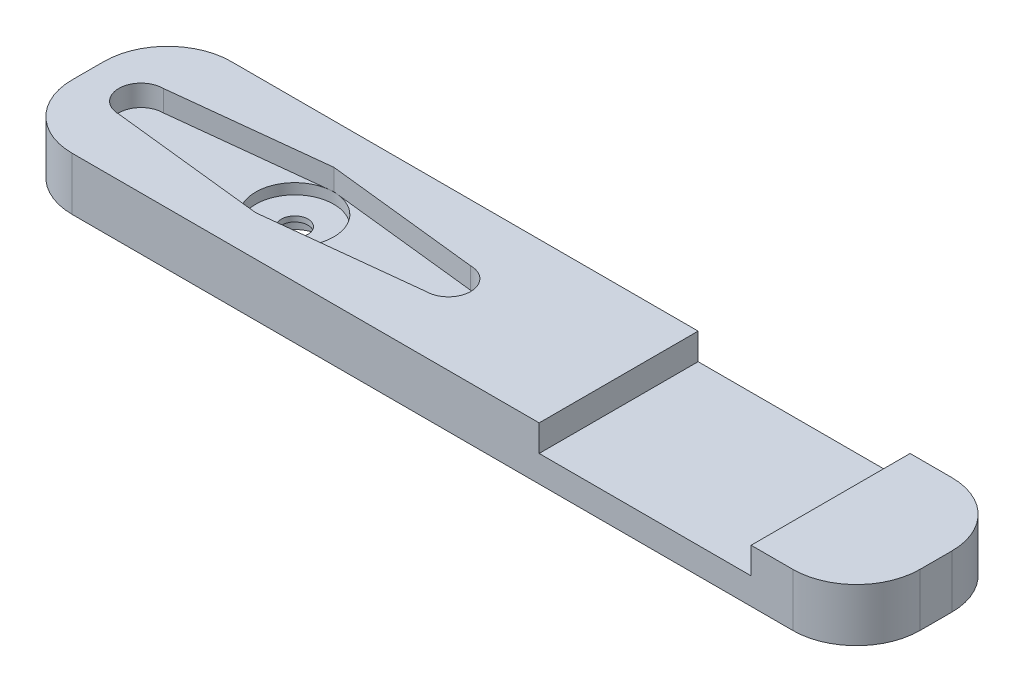
ISO-10303-21;
HEADER;
FILE_DESCRIPTION(('STEP AP214'),'2;1');
FILE_NAME('part.step','',(''),(''),'','','');
FILE_SCHEMA(('AUTOMOTIVE_DESIGN { 1 0 10303 214 1 1 1 1 }'));
ENDSEC;
DATA;
#1=APPLICATION_CONTEXT('core data for automotive mechanical design processes');
#2=APPLICATION_PROTOCOL_DEFINITION('international standard','automotive_design',2000,#1);
#3=PRODUCT_CONTEXT('',#1,'mechanical');
#4=PRODUCT('Part','Part','',(#3));
#5=PRODUCT_RELATED_PRODUCT_CATEGORY('part','',(#4));
#6=PRODUCT_DEFINITION_FORMATION('','',#4);
#7=PRODUCT_DEFINITION_CONTEXT('part definition',#1,'design');
#8=PRODUCT_DEFINITION('design','',#6,#7);
#9=PRODUCT_DEFINITION_SHAPE('','',#8);
#10=(LENGTH_UNIT() NAMED_UNIT(*) SI_UNIT(.MILLI.,.METRE.));
#11=(NAMED_UNIT(*) PLANE_ANGLE_UNIT() SI_UNIT($,.RADIAN.));
#12=(NAMED_UNIT(*) SI_UNIT($,.STERADIAN.) SOLID_ANGLE_UNIT());
#13=UNCERTAINTY_MEASURE_WITH_UNIT(LENGTH_MEASURE(1.E-05),#10,'distance_accuracy_value','');
#14=(GEOMETRIC_REPRESENTATION_CONTEXT(3) GLOBAL_UNCERTAINTY_ASSIGNED_CONTEXT((#13)) GLOBAL_UNIT_ASSIGNED_CONTEXT((#10,
#11,#12)) REPRESENTATION_CONTEXT('',''));
#15=CARTESIAN_POINT('',(0.,0.,0.));
#16=DIRECTION('',(0.,0.,1.));
#17=DIRECTION('',(1.,0.,0.));
#18=AXIS2_PLACEMENT_3D('',#15,#16,#17);
#19=CARTESIAN_POINT('',(-20.5,0.,0.));
#20=DIRECTION('',(0.,1.,0.));
#21=DIRECTION('',(0.,0.,1.));
#22=AXIS2_PLACEMENT_3D('',#19,#20,#21);
#23=CYLINDRICAL_SURFACE('',#22,1.25);
#24=CARTESIAN_POINT('',(-20.5,1.5,0.));
#25=DIRECTION('',(0.,-1.,0.));
#26=DIRECTION('',(0.,0.,-1.));
#27=AXIS2_PLACEMENT_3D('',#24,#25,#26);
#28=CIRCLE('',#27,1.25);
#29=CARTESIAN_POINT('',(-20.5,1.5,-1.25));
#30=VERTEX_POINT('',#29);
#31=EDGE_CURVE('E236',#30,#30,#28,.F.);
#32=ORIENTED_EDGE('',*,*,#31,.F.);
#33=EDGE_LOOP('',(#32));
#34=FACE_BOUND('',#33,.T.);
#35=CARTESIAN_POINT('',(-20.5,2.,0.));
#36=DIRECTION('',(0.,1.,0.));
#37=DIRECTION('',(0.,0.,1.));
#38=AXIS2_PLACEMENT_3D('',#35,#36,#37);
#39=CIRCLE('',#38,1.25);
#40=CARTESIAN_POINT('',(-20.5,2.,1.25));
#41=VERTEX_POINT('',#40);
#42=EDGE_CURVE('E49',#41,#41,#39,.F.);
#43=ORIENTED_EDGE('',*,*,#42,.F.);
#44=EDGE_LOOP('',(#43));
#45=FACE_BOUND('',#44,.T.);
#46=ADVANCED_FACE('F45',(#34,#45),#23,.F.);
#47=CARTESIAN_POINT('',(-6.,3.,0.));
#48=DIRECTION('',(0.,1.,0.));
#49=DIRECTION('',(0.,0.,1.));
#50=AXIS2_PLACEMENT_3D('',#47,#48,#49);
#51=PLANE('',#50);
#52=CARTESIAN_POINT('',(-20.5,3.,0.));
#53=DIRECTION('',(0.,1.,0.));
#54=DIRECTION('',(0.,0.,1.));
#55=AXIS2_PLACEMENT_3D('',#52,#53,#54);
#56=CIRCLE('',#55,3.67767807313066);
#57=CARTESIAN_POINT('',(-20.0966354964522,3.,3.65549081340163));
#58=VERTEX_POINT('',#57);
#59=CARTESIAN_POINT('',(-20.0966354964522,3.,-3.65549081340163));
#60=VERTEX_POINT('',#59);
#61=EDGE_CURVE('E182',#58,#60,#56,.T.);
#62=ORIENTED_EDGE('',*,*,#61,.F.);
#63=DIRECTION('',(0.993967046792069,0.,-0.109679122404642));
#64=VECTOR('',#63,1.);
#65=CARTESIAN_POINT('',(-20.5,3.,3.7));
#66=LINE('',#65,#64);
#67=CARTESIAN_POINT('',(-6.,3.,2.1));
#68=VERTEX_POINT('',#67);
#69=EDGE_CURVE('E195',#58,#68,#66,.T.);
#70=ORIENTED_EDGE('',*,*,#69,.T.);
#71=CARTESIAN_POINT('',(-6.,3.,0.));
#72=DIRECTION('',(0.,1.,0.));
#73=DIRECTION('',(0.,0.,1.));
#74=AXIS2_PLACEMENT_3D('',#71,#72,#73);
#75=CIRCLE('',#74,2.1);
#76=CARTESIAN_POINT('',(-6.,3.,-2.1));
#77=VERTEX_POINT('',#76);
#78=EDGE_CURVE('E210',#68,#77,#75,.T.);
#79=ORIENTED_EDGE('',*,*,#78,.T.);
#80=DIRECTION('',(0.993967046792069,0.,0.109679122404642));
#81=VECTOR('',#80,1.);
#82=CARTESIAN_POINT('',(-20.5,3.,-3.7));
#83=LINE('',#82,#81);
#84=EDGE_CURVE('E197',#60,#77,#83,.T.);
#85=ORIENTED_EDGE('',*,*,#84,.F.);
#86=EDGE_LOOP('',(#62,#70,#79,#85));
#87=FACE_BOUND('',#86,.T.);
#88=ADVANCED_FACE('F193',(#87),#51,.T.);
#89=CARTESIAN_POINT('',(-20.5,3.,0.));
#90=DIRECTION('',(0.,1.,0.));
#91=DIRECTION('',(0.,0.,1.));
#92=AXIS2_PLACEMENT_3D('',#89,#90,#91);
#93=CIRCLE('',#92,3.67767807313066);
#94=CARTESIAN_POINT('',(-20.9033645035478,3.,-3.65549081340163));
#95=VERTEX_POINT('',#94);
#96=EDGE_CURVE('E11',#60,#95,#93,.T.);
#97=ORIENTED_EDGE('',*,*,#96,.F.);
#98=CARTESIAN_POINT('',(-20.5,3.,-3.7));
#99=VERTEX_POINT('',#98);
#100=EDGE_CURVE('E409',#99,#60,#83,.T.);
#101=ORIENTED_EDGE('',*,*,#100,.F.);
#102=DIRECTION('',(-0.993967046792069,0.,0.109679122404642));
#103=VECTOR('',#102,1.);
#104=CARTESIAN_POINT('',(-20.5,3.,-3.7));
#105=LINE('',#104,#103);
#106=EDGE_CURVE('E228',#99,#95,#105,.T.);
#107=ORIENTED_EDGE('',*,*,#106,.T.);
#108=EDGE_LOOP('',(#97,#101,#107));
#109=FACE_BOUND('',#108,.T.);
#110=ADVANCED_FACE('F430',(#109),#51,.T.);
#111=CARTESIAN_POINT('',(-20.9033645035478,3.,3.65549081340163));
#112=VERTEX_POINT('',#111);
#113=EDGE_CURVE('E55',#95,#112,#93,.T.);
#114=ORIENTED_EDGE('',*,*,#113,.F.);
#115=CARTESIAN_POINT('',(-35.,3.,-2.1));
#116=VERTEX_POINT('',#115);
#117=EDGE_CURVE('E227',#95,#116,#105,.T.);
#118=ORIENTED_EDGE('',*,*,#117,.T.);
#119=CARTESIAN_POINT('',(-35.,3.,0.));
#120=DIRECTION('',(0.,-1.,0.));
#121=DIRECTION('',(0.,0.,-1.));
#122=AXIS2_PLACEMENT_3D('',#119,#120,#121);
#123=CIRCLE('',#122,2.1);
#124=CARTESIAN_POINT('',(-35.,3.,2.1));
#125=VERTEX_POINT('',#124);
#126=EDGE_CURVE('E223',#125,#116,#123,.T.);
#127=ORIENTED_EDGE('',*,*,#126,.F.);
#128=DIRECTION('',(-0.993967046792069,0.,-0.109679122404642));
#129=VECTOR('',#128,1.);
#130=CARTESIAN_POINT('',(-20.5,3.,3.7));
#131=LINE('',#130,#129);
#132=EDGE_CURVE('E216',#112,#125,#131,.T.);
#133=ORIENTED_EDGE('',*,*,#132,.F.);
#134=EDGE_LOOP('',(#114,#118,#127,#133));
#135=FACE_BOUND('',#134,.T.);
#136=ADVANCED_FACE('F432',(#135),#51,.T.);
#137=CARTESIAN_POINT('',(0.,5.,0.));
#138=DIRECTION('',(0.,1.,0.));
#139=DIRECTION('',(0.,0.,1.));
#140=AXIS2_PLACEMENT_3D('',#137,#138,#139);
#141=PLANE('',#140);
#142=DIRECTION('',(0.,0.,1.));
#143=VECTOR('',#142,1.);
#144=CARTESIAN_POINT('',(10.0624636176874,5.,-7.5));
#145=LINE('',#144,#143);
#146=CARTESIAN_POINT('',(10.0624636176874,5.,-7.5));
#147=VERTEX_POINT('',#146);
#148=CARTESIAN_POINT('',(10.0624636176874,5.,7.5));
#149=VERTEX_POINT('',#148);
#150=EDGE_CURVE('E271',#147,#149,#145,.T.);
#151=ORIENTED_EDGE('',*,*,#150,.F.);
#152=DIRECTION('',(-1.,0.,0.));
#153=VECTOR('',#152,1.);
#154=CARTESIAN_POINT('',(40.,5.,-7.50000000000001));
#155=LINE('',#154,#153);
#156=CARTESIAN_POINT('',(-34.,5.,-7.5));
#157=VERTEX_POINT('',#156);
#158=EDGE_CURVE('E322',#147,#157,#155,.T.);
#159=ORIENTED_EDGE('',*,*,#158,.T.);
#160=CARTESIAN_POINT('',(-34.,5.,-1.5));
#161=DIRECTION('',(0.,1.,0.));
#162=DIRECTION('',(0.,0.,1.));
#163=AXIS2_PLACEMENT_3D('',#160,#161,#162);
#164=CIRCLE('',#163,6.);
#165=CARTESIAN_POINT('',(-40.,5.,-1.5));
#166=VERTEX_POINT('',#165);
#167=EDGE_CURVE('E368',#157,#166,#164,.T.);
#168=ORIENTED_EDGE('',*,*,#167,.T.);
#169=DIRECTION('',(0.,0.,1.));
#170=VECTOR('',#169,1.);
#171=CARTESIAN_POINT('',(-40.,5.,7.5));
#172=LINE('',#171,#170);
#173=CARTESIAN_POINT('',(-40.,5.,1.5));
#174=VERTEX_POINT('',#173);
#175=EDGE_CURVE('E308',#166,#174,#172,.T.);
#176=ORIENTED_EDGE('',*,*,#175,.T.);
#177=CARTESIAN_POINT('',(-34.,5.,1.5));
#178=DIRECTION('',(0.,1.,0.));
#179=DIRECTION('',(0.,0.,1.));
#180=AXIS2_PLACEMENT_3D('',#177,#178,#179);
#181=CIRCLE('',#180,6.);
#182=CARTESIAN_POINT('',(-34.,5.,7.5));
#183=VERTEX_POINT('',#182);
#184=EDGE_CURVE('E371',#174,#183,#181,.T.);
#185=ORIENTED_EDGE('',*,*,#184,.T.);
#186=DIRECTION('',(1.,0.,0.));
#187=VECTOR('',#186,1.);
#188=CARTESIAN_POINT('',(40.,5.,7.49999999999999));
#189=LINE('',#188,#187);
#190=EDGE_CURVE('E314',#183,#149,#189,.T.);
#191=ORIENTED_EDGE('',*,*,#190,.T.);
#192=EDGE_LOOP('',(#151,#159,#168,#176,#185,#191));
#193=FACE_BOUND('',#192,.T.);
#194=DIRECTION('',(-0.993967046792069,0.,0.109679122404642));
#195=VECTOR('',#194,1.);
#196=CARTESIAN_POINT('',(-20.5,5.,-3.7));
#197=LINE('',#196,#195);
#198=CARTESIAN_POINT('',(-20.5,5.,-3.7));
#199=VERTEX_POINT('',#198);
#200=CARTESIAN_POINT('',(-35.,5.,-2.1));
#201=VERTEX_POINT('',#200);
#202=EDGE_CURVE('E251',#199,#201,#197,.T.);
#203=ORIENTED_EDGE('',*,*,#202,.F.);
#204=DIRECTION('',(0.993967046792069,0.,0.109679122404642));
#205=VECTOR('',#204,1.);
#206=CARTESIAN_POINT('',(-20.5,5.,-3.7));
#207=LINE('',#206,#205);
#208=CARTESIAN_POINT('',(-6.,5.,-2.1));
#209=VERTEX_POINT('',#208);
#210=EDGE_CURVE('E69',#199,#209,#207,.T.);
#211=ORIENTED_EDGE('',*,*,#210,.T.);
#212=CARTESIAN_POINT('',(-6.,5.,0.));
#213=DIRECTION('',(0.,1.,0.));
#214=DIRECTION('',(0.,0.,1.));
#215=AXIS2_PLACEMENT_3D('',#212,#213,#214);
#216=CIRCLE('',#215,2.1);
#217=CARTESIAN_POINT('',(-6.,5.,2.1));
#218=VERTEX_POINT('',#217);
#219=EDGE_CURVE('E235',#218,#209,#216,.T.);
#220=ORIENTED_EDGE('',*,*,#219,.F.);
#221=DIRECTION('',(0.993967046792069,0.,-0.109679122404642));
#222=VECTOR('',#221,1.);
#223=CARTESIAN_POINT('',(-20.5,5.,3.7));
#224=LINE('',#223,#222);
#225=CARTESIAN_POINT('',(-20.5,5.,3.7));
#226=VERTEX_POINT('',#225);
#227=EDGE_CURVE('E240',#226,#218,#224,.T.);
#228=ORIENTED_EDGE('',*,*,#227,.F.);
#229=DIRECTION('',(-0.993967046792069,0.,-0.109679122404642));
#230=VECTOR('',#229,1.);
#231=CARTESIAN_POINT('',(-20.5,5.,3.7));
#232=LINE('',#231,#230);
#233=CARTESIAN_POINT('',(-35.,5.,2.1));
#234=VERTEX_POINT('',#233);
#235=EDGE_CURVE('E243',#226,#234,#232,.T.);
#236=ORIENTED_EDGE('',*,*,#235,.T.);
#237=CARTESIAN_POINT('',(-35.,5.,0.));
#238=DIRECTION('',(0.,-1.,0.));
#239=DIRECTION('',(0.,0.,-1.));
#240=AXIS2_PLACEMENT_3D('',#237,#238,#239);
#241=CIRCLE('',#240,2.1);
#242=EDGE_CURVE('E247',#234,#201,#241,.T.);
#243=ORIENTED_EDGE('',*,*,#242,.T.);
#244=EDGE_LOOP('',(#203,#211,#220,#228,#236,#243));
#245=FACE_BOUND('',#244,.T.);
#246=ADVANCED_FACE('F422',(#193,#245),#141,.T.);
#247=CARTESIAN_POINT('',(-40.,5.,7.5));
#248=DIRECTION('',(1.,0.,0.));
#249=DIRECTION('',(0.,0.,-1.));
#250=AXIS2_PLACEMENT_3D('',#247,#248,#249);
#251=PLANE('',#250);
#252=DIRECTION('',(0.,0.,1.));
#253=VECTOR('',#252,1.);
#254=CARTESIAN_POINT('',(-40.,0.,7.5));
#255=LINE('',#254,#253);
#256=CARTESIAN_POINT('',(-40.,0.,-1.5));
#257=VERTEX_POINT('',#256);
#258=CARTESIAN_POINT('',(-40.,0.,1.5));
#259=VERTEX_POINT('',#258);
#260=EDGE_CURVE('E297',#257,#259,#255,.T.);
#261=ORIENTED_EDGE('',*,*,#260,.T.);
#262=DIRECTION('',(0.,-1.,0.));
#263=VECTOR('',#262,1.);
#264=CARTESIAN_POINT('',(-40.,5.,1.5));
#265=LINE('',#264,#263);
#266=EDGE_CURVE('E189',#259,#174,#265,.F.);
#267=ORIENTED_EDGE('',*,*,#266,.T.);
#268=ORIENTED_EDGE('',*,*,#175,.F.);
#269=DIRECTION('',(0.,-1.,0.));
#270=VECTOR('',#269,1.);
#271=CARTESIAN_POINT('',(-40.,5.,-1.5));
#272=LINE('',#271,#270);
#273=EDGE_CURVE('E388',#166,#257,#272,.T.);
#274=ORIENTED_EDGE('',*,*,#273,.T.);
#275=EDGE_LOOP('',(#261,#267,#268,#274));
#276=FACE_BOUND('',#275,.T.);
#277=ADVANCED_FACE('F452',(#276),#251,.F.);
#278=CARTESIAN_POINT('',(40.,5.,7.49999999999999));
#279=DIRECTION('',(0.,0.,-1.));
#280=DIRECTION('',(-1.,0.,0.));
#281=AXIS2_PLACEMENT_3D('',#278,#279,#280);
#282=PLANE('',#281);
#283=DIRECTION('',(1.,0.,0.));
#284=VECTOR('',#283,1.);
#285=CARTESIAN_POINT('',(10.0624636176874,2.5,7.5));
#286=LINE('',#285,#284);
#287=CARTESIAN_POINT('',(10.0624636176874,2.5,7.5));
#288=VERTEX_POINT('',#287);
#289=CARTESIAN_POINT('',(30.0624636176874,2.5,7.5));
#290=VERTEX_POINT('',#289);
#291=EDGE_CURVE('E276',#288,#290,#286,.T.);
#292=ORIENTED_EDGE('',*,*,#291,.F.);
#293=DIRECTION('',(0.,1.,0.));
#294=VECTOR('',#293,1.);
#295=CARTESIAN_POINT('',(10.0624636176874,2.5,7.5));
#296=LINE('',#295,#294);
#297=EDGE_CURVE('E289',#288,#149,#296,.T.);
#298=ORIENTED_EDGE('',*,*,#297,.T.);
#299=ORIENTED_EDGE('',*,*,#190,.F.);
#300=DIRECTION('',(0.,-1.,0.));
#301=VECTOR('',#300,1.);
#302=CARTESIAN_POINT('',(-34.,5.,7.5));
#303=LINE('',#302,#301);
#304=CARTESIAN_POINT('',(-34.,0.,7.5));
#305=VERTEX_POINT('',#304);
#306=EDGE_CURVE('E360',#183,#305,#303,.T.);
#307=ORIENTED_EDGE('',*,*,#306,.T.);
#308=DIRECTION('',(1.,0.,0.));
#309=VECTOR('',#308,1.);
#310=CARTESIAN_POINT('',(40.,0.,7.49999999999999));
#311=LINE('',#310,#309);
#312=CARTESIAN_POINT('',(34.,0.,7.49999999999999));
#313=VERTEX_POINT('',#312);
#314=EDGE_CURVE('E331',#305,#313,#311,.T.);
#315=ORIENTED_EDGE('',*,*,#314,.T.);
#316=DIRECTION('',(0.,-1.,0.));
#317=VECTOR('',#316,1.);
#318=CARTESIAN_POINT('',(34.,5.,7.49999999999999));
#319=LINE('',#318,#317);
#320=CARTESIAN_POINT('',(34.,5.,7.49999999999999));
#321=VERTEX_POINT('',#320);
#322=EDGE_CURVE('E364',#313,#321,#319,.F.);
#323=ORIENTED_EDGE('',*,*,#322,.T.);
#324=CARTESIAN_POINT('',(30.0624636176874,5.,7.49999999999999));
#325=VERTEX_POINT('',#324);
#326=EDGE_CURVE('E312',#325,#321,#189,.T.);
#327=ORIENTED_EDGE('',*,*,#326,.F.);
#328=DIRECTION('',(0.,1.,0.));
#329=VECTOR('',#328,1.);
#330=CARTESIAN_POINT('',(30.0624636176874,2.5,7.5));
#331=LINE('',#330,#329);
#332=EDGE_CURVE('E302',#290,#325,#331,.T.);
#333=ORIENTED_EDGE('',*,*,#332,.F.);
#334=EDGE_LOOP('',(#292,#298,#299,#307,#315,#323,#327,#333));
#335=FACE_BOUND('',#334,.T.);
#336=ADVANCED_FACE('F465',(#335),#282,.F.);
#337=CARTESIAN_POINT('',(40.,5.,7.49999999999999));
#338=DIRECTION('',(-1.,0.,0.));
#339=DIRECTION('',(0.,0.,1.));
#340=AXIS2_PLACEMENT_3D('',#337,#338,#339);
#341=PLANE('',#340);
#342=DIRECTION('',(0.,0.,-1.));
#343=VECTOR('',#342,1.);
#344=CARTESIAN_POINT('',(40.,5.,7.49999999999999));
#345=LINE('',#344,#343);
#346=CARTESIAN_POINT('',(40.,5.,1.49999999999999));
#347=VERTEX_POINT('',#346);
#348=CARTESIAN_POINT('',(40.,5.,-1.5));
#349=VERTEX_POINT('',#348);
#350=EDGE_CURVE('E318',#347,#349,#345,.T.);
#351=ORIENTED_EDGE('',*,*,#350,.F.);
#352=DIRECTION('',(0.,-1.,0.));
#353=VECTOR('',#352,1.);
#354=CARTESIAN_POINT('',(40.,5.,1.49999999999999));
#355=LINE('',#354,#353);
#356=CARTESIAN_POINT('',(40.,0.,1.49999999999999));
#357=VERTEX_POINT('',#356);
#358=EDGE_CURVE('E344',#347,#357,#355,.T.);
#359=ORIENTED_EDGE('',*,*,#358,.T.);
#360=DIRECTION('',(0.,0.,-1.));
#361=VECTOR('',#360,1.);
#362=CARTESIAN_POINT('',(40.,0.,7.49999999999999));
#363=LINE('',#362,#361);
#364=CARTESIAN_POINT('',(40.,0.,-1.5));
#365=VERTEX_POINT('',#364);
#366=EDGE_CURVE('E335',#357,#365,#363,.T.);
#367=ORIENTED_EDGE('',*,*,#366,.T.);
#368=DIRECTION('',(0.,-1.,0.));
#369=VECTOR('',#368,1.);
#370=CARTESIAN_POINT('',(40.,5.,-1.5));
#371=LINE('',#370,#369);
#372=EDGE_CURVE('E327',#365,#349,#371,.F.);
#373=ORIENTED_EDGE('',*,*,#372,.T.);
#374=EDGE_LOOP('',(#351,#359,#367,#373));
#375=FACE_BOUND('',#374,.T.);
#376=ADVANCED_FACE('F486',(#375),#341,.F.);
#377=CARTESIAN_POINT('',(40.,5.,-7.50000000000001));
#378=DIRECTION('',(0.,0.,1.));
#379=DIRECTION('',(1.,0.,0.));
#380=AXIS2_PLACEMENT_3D('',#377,#378,#379);
#381=PLANE('',#380);
#382=ORIENTED_EDGE('',*,*,#158,.F.);
#383=DIRECTION('',(0.,1.,0.));
#384=VECTOR('',#383,1.);
#385=CARTESIAN_POINT('',(10.0624636176874,2.5,-7.5));
#386=LINE('',#385,#384);
#387=CARTESIAN_POINT('',(10.0624636176874,2.5,-7.5));
#388=VERTEX_POINT('',#387);
#389=EDGE_CURVE('E294',#388,#147,#386,.T.);
#390=ORIENTED_EDGE('',*,*,#389,.F.);
#391=DIRECTION('',(-1.,0.,0.));
#392=VECTOR('',#391,1.);
#393=CARTESIAN_POINT('',(10.0624636176874,2.5,-7.5));
#394=LINE('',#393,#392);
#395=CARTESIAN_POINT('',(30.0624636176874,2.5,-7.5));
#396=VERTEX_POINT('',#395);
#397=EDGE_CURVE('E285',#396,#388,#394,.T.);
#398=ORIENTED_EDGE('',*,*,#397,.F.);
#399=DIRECTION('',(0.,1.,0.));
#400=VECTOR('',#399,1.);
#401=CARTESIAN_POINT('',(30.0624636176874,2.5,-7.5));
#402=LINE('',#401,#400);
#403=CARTESIAN_POINT('',(30.0624636176874,5.,-7.5));
#404=VERTEX_POINT('',#403);
#405=EDGE_CURVE('E298',#396,#404,#402,.T.);
#406=ORIENTED_EDGE('',*,*,#405,.T.);
#407=CARTESIAN_POINT('',(34.,5.,-7.50000000000001));
#408=VERTEX_POINT('',#407);
#409=EDGE_CURVE('E323',#408,#404,#155,.T.);
#410=ORIENTED_EDGE('',*,*,#409,.F.);
#411=DIRECTION('',(0.,-1.,0.));
#412=VECTOR('',#411,1.);
#413=CARTESIAN_POINT('',(34.,5.,-7.50000000000001));
#414=LINE('',#413,#412);
#415=CARTESIAN_POINT('',(34.,0.,-7.50000000000001));
#416=VERTEX_POINT('',#415);
#417=EDGE_CURVE('E384',#408,#416,#414,.T.);
#418=ORIENTED_EDGE('',*,*,#417,.T.);
#419=DIRECTION('',(-1.,0.,0.));
#420=VECTOR('',#419,1.);
#421=CARTESIAN_POINT('',(40.,0.,-7.50000000000001));
#422=LINE('',#421,#420);
#423=CARTESIAN_POINT('',(-34.,0.,-7.5));
#424=VERTEX_POINT('',#423);
#425=EDGE_CURVE('E313',#416,#424,#422,.T.);
#426=ORIENTED_EDGE('',*,*,#425,.T.);
#427=DIRECTION('',(0.,-1.,0.));
#428=VECTOR('',#427,1.);
#429=CARTESIAN_POINT('',(-34.,5.,-7.5));
#430=LINE('',#429,#428);
#431=EDGE_CURVE('E380',#424,#157,#430,.F.);
#432=ORIENTED_EDGE('',*,*,#431,.T.);
#433=EDGE_LOOP('',(#382,#390,#398,#406,#410,#418,#426,#432));
#434=FACE_BOUND('',#433,.T.);
#435=ADVANCED_FACE('F446',(#434),#381,.F.);
#436=DIRECTION('',(0.,0.,-1.));
#437=VECTOR('',#436,1.);
#438=CARTESIAN_POINT('',(30.0624636176874,5.,-7.5));
#439=LINE('',#438,#437);
#440=EDGE_CURVE('E277',#325,#404,#439,.T.);
#441=ORIENTED_EDGE('',*,*,#440,.F.);
#442=ORIENTED_EDGE('',*,*,#326,.T.);
#443=CARTESIAN_POINT('',(34.,5.,1.49999999999999));
#444=DIRECTION('',(0.,1.,0.));
#445=DIRECTION('',(0.,0.,1.));
#446=AXIS2_PLACEMENT_3D('',#443,#444,#445);
#447=CIRCLE('',#446,6.);
#448=EDGE_CURVE('E377',#321,#347,#447,.T.);
#449=ORIENTED_EDGE('',*,*,#448,.T.);
#450=ORIENTED_EDGE('',*,*,#350,.T.);
#451=CARTESIAN_POINT('',(34.,5.,-1.5));
#452=DIRECTION('',(0.,1.,0.));
#453=DIRECTION('',(0.,0.,1.));
#454=AXIS2_PLACEMENT_3D('',#451,#452,#453);
#455=CIRCLE('',#454,6.);
#456=EDGE_CURVE('E374',#349,#408,#455,.T.);
#457=ORIENTED_EDGE('',*,*,#456,.T.);
#458=ORIENTED_EDGE('',*,*,#409,.T.);
#459=EDGE_LOOP('',(#441,#442,#449,#450,#457,#458));
#460=FACE_BOUND('',#459,.T.);
#461=ADVANCED_FACE('F478',(#460),#141,.T.);
#462=CARTESIAN_POINT('',(0.,0.,0.));
#463=DIRECTION('',(0.,1.,0.));
#464=DIRECTION('',(0.,0.,1.));
#465=AXIS2_PLACEMENT_3D('',#462,#463,#464);
#466=PLANE('',#465);
#467=CARTESIAN_POINT('',(-20.5,0.,0.));
#468=DIRECTION('',(0.,-1.,0.));
#469=DIRECTION('',(0.,0.,-1.));
#470=AXIS2_PLACEMENT_3D('',#467,#468,#469);
#471=CIRCLE('',#470,2.5);
#472=CARTESIAN_POINT('',(-20.5,0.,-2.5));
#473=VERTEX_POINT('',#472);
#474=EDGE_CURVE('E401',#473,#473,#471,.T.);
#475=ORIENTED_EDGE('',*,*,#474,.F.);
#476=EDGE_LOOP('',(#475));
#477=FACE_BOUND('',#476,.T.);
#478=ORIENTED_EDGE('',*,*,#366,.F.);
#479=CARTESIAN_POINT('',(34.,0.,1.49999999999999));
#480=DIRECTION('',(0.,1.,0.));
#481=DIRECTION('',(0.,0.,1.));
#482=AXIS2_PLACEMENT_3D('',#479,#480,#481);
#483=CIRCLE('',#482,6.);
#484=EDGE_CURVE('E357',#357,#313,#483,.F.);
#485=ORIENTED_EDGE('',*,*,#484,.T.);
#486=ORIENTED_EDGE('',*,*,#314,.F.);
#487=CARTESIAN_POINT('',(-34.,0.,1.5));
#488=DIRECTION('',(0.,1.,0.));
#489=DIRECTION('',(0.,0.,1.));
#490=AXIS2_PLACEMENT_3D('',#487,#488,#489);
#491=CIRCLE('',#490,6.);
#492=EDGE_CURVE('E351',#305,#259,#491,.F.);
#493=ORIENTED_EDGE('',*,*,#492,.T.);
#494=ORIENTED_EDGE('',*,*,#260,.F.);
#495=CARTESIAN_POINT('',(-34.,0.,-1.5));
#496=DIRECTION('',(0.,1.,0.));
#497=DIRECTION('',(0.,0.,1.));
#498=AXIS2_PLACEMENT_3D('',#495,#496,#497);
#499=CIRCLE('',#498,6.);
#500=EDGE_CURVE('E348',#257,#424,#499,.F.);
#501=ORIENTED_EDGE('',*,*,#500,.T.);
#502=ORIENTED_EDGE('',*,*,#425,.F.);
#503=CARTESIAN_POINT('',(34.,0.,-1.5));
#504=DIRECTION('',(0.,1.,0.));
#505=DIRECTION('',(0.,0.,1.));
#506=AXIS2_PLACEMENT_3D('',#503,#504,#505);
#507=CIRCLE('',#506,6.);
#508=EDGE_CURVE('E354',#416,#365,#507,.F.);
#509=ORIENTED_EDGE('',*,*,#508,.T.);
#510=EDGE_LOOP('',(#478,#485,#486,#493,#494,#501,#502,#509));
#511=FACE_BOUND('',#510,.T.);
#512=ADVANCED_FACE('F456',(#477,#511),#466,.F.);
#513=CARTESIAN_POINT('',(34.,5.,1.49999999999999));
#514=DIRECTION('',(0.,-1.,0.));
#515=DIRECTION('',(0.,0.,-1.));
#516=AXIS2_PLACEMENT_3D('',#513,#514,#515);
#517=CYLINDRICAL_SURFACE('',#516,6.);
#518=ORIENTED_EDGE('',*,*,#448,.F.);
#519=ORIENTED_EDGE('',*,*,#322,.F.);
#520=ORIENTED_EDGE('',*,*,#484,.F.);
#521=ORIENTED_EDGE('',*,*,#358,.F.);
#522=EDGE_LOOP('',(#518,#519,#520,#521));
#523=FACE_BOUND('',#522,.T.);
#524=ADVANCED_FACE('F490',(#523),#517,.T.);
#525=CARTESIAN_POINT('',(34.,5.,-1.5));
#526=DIRECTION('',(0.,-1.,0.));
#527=DIRECTION('',(0.,0.,-1.));
#528=AXIS2_PLACEMENT_3D('',#525,#526,#527);
#529=CYLINDRICAL_SURFACE('',#528,6.);
#530=ORIENTED_EDGE('',*,*,#456,.F.);
#531=ORIENTED_EDGE('',*,*,#372,.F.);
#532=ORIENTED_EDGE('',*,*,#508,.F.);
#533=ORIENTED_EDGE('',*,*,#417,.F.);
#534=EDGE_LOOP('',(#530,#531,#532,#533));
#535=FACE_BOUND('',#534,.T.);
#536=ADVANCED_FACE('F484',(#535),#529,.T.);
#537=CARTESIAN_POINT('',(-34.,5.,1.5));
#538=DIRECTION('',(0.,-1.,0.));
#539=DIRECTION('',(0.,0.,-1.));
#540=AXIS2_PLACEMENT_3D('',#537,#538,#539);
#541=CYLINDRICAL_SURFACE('',#540,6.);
#542=ORIENTED_EDGE('',*,*,#184,.F.);
#543=ORIENTED_EDGE('',*,*,#266,.F.);
#544=ORIENTED_EDGE('',*,*,#492,.F.);
#545=ORIENTED_EDGE('',*,*,#306,.F.);
#546=EDGE_LOOP('',(#542,#543,#544,#545));
#547=FACE_BOUND('',#546,.T.);
#548=ADVANCED_FACE('F461',(#547),#541,.T.);
#549=CARTESIAN_POINT('',(-34.,5.,-1.5));
#550=DIRECTION('',(0.,-1.,0.));
#551=DIRECTION('',(0.,0.,-1.));
#552=AXIS2_PLACEMENT_3D('',#549,#550,#551);
#553=CYLINDRICAL_SURFACE('',#552,6.);
#554=ORIENTED_EDGE('',*,*,#167,.F.);
#555=ORIENTED_EDGE('',*,*,#431,.F.);
#556=ORIENTED_EDGE('',*,*,#500,.F.);
#557=ORIENTED_EDGE('',*,*,#273,.F.);
#558=EDGE_LOOP('',(#554,#555,#556,#557));
#559=FACE_BOUND('',#558,.T.);
#560=ADVANCED_FACE('F47',(#559),#553,.T.);
#561=CARTESIAN_POINT('',(10.0624636176874,2.5,-7.5));
#562=DIRECTION('',(-1.,0.,0.));
#563=DIRECTION('',(0.,0.,1.));
#564=AXIS2_PLACEMENT_3D('',#561,#562,#563);
#565=PLANE('',#564);
#566=ORIENTED_EDGE('',*,*,#150,.T.);
#567=ORIENTED_EDGE('',*,*,#297,.F.);
#568=DIRECTION('',(0.,0.,1.));
#569=VECTOR('',#568,1.);
#570=CARTESIAN_POINT('',(10.0624636176874,2.5,-7.5));
#571=LINE('',#570,#569);
#572=EDGE_CURVE('E272',#388,#288,#571,.T.);
#573=ORIENTED_EDGE('',*,*,#572,.F.);
#574=ORIENTED_EDGE('',*,*,#389,.T.);
#575=EDGE_LOOP('',(#566,#567,#573,#574));
#576=FACE_BOUND('',#575,.T.);
#577=ADVANCED_FACE('F469',(#576),#565,.F.);
#578=CARTESIAN_POINT('',(30.0624636176874,2.5,-7.5));
#579=DIRECTION('',(1.,0.,0.));
#580=DIRECTION('',(0.,0.,-1.));
#581=AXIS2_PLACEMENT_3D('',#578,#579,#580);
#582=PLANE('',#581);
#583=ORIENTED_EDGE('',*,*,#440,.T.);
#584=ORIENTED_EDGE('',*,*,#405,.F.);
#585=DIRECTION('',(0.,0.,-1.));
#586=VECTOR('',#585,1.);
#587=CARTESIAN_POINT('',(30.0624636176874,2.5,-7.5));
#588=LINE('',#587,#586);
#589=EDGE_CURVE('E281',#290,#396,#588,.T.);
#590=ORIENTED_EDGE('',*,*,#589,.F.);
#591=ORIENTED_EDGE('',*,*,#332,.T.);
#592=EDGE_LOOP('',(#583,#584,#590,#591));
#593=FACE_BOUND('',#592,.T.);
#594=ADVANCED_FACE('F491',(#593),#582,.F.);
#595=CARTESIAN_POINT('',(0.,2.5,0.));
#596=DIRECTION('',(0.,1.,0.));
#597=DIRECTION('',(0.,0.,1.));
#598=AXIS2_PLACEMENT_3D('',#595,#596,#597);
#599=PLANE('',#598);
#600=ORIENTED_EDGE('',*,*,#572,.T.);
#601=ORIENTED_EDGE('',*,*,#291,.T.);
#602=ORIENTED_EDGE('',*,*,#589,.T.);
#603=ORIENTED_EDGE('',*,*,#397,.T.);
#604=EDGE_LOOP('',(#600,#601,#602,#603));
#605=FACE_BOUND('',#604,.T.);
#606=ADVANCED_FACE('F471',(#605),#599,.T.);
#607=CARTESIAN_POINT('',(-20.5,3.,-3.7));
#608=DIRECTION('',(-0.109679122404642,0.,0.993967046792069));
#609=DIRECTION('',(0.993967046792069,0.,0.109679122404642));
#610=AXIS2_PLACEMENT_3D('',#607,#608,#609);
#611=PLANE('',#610);
#612=ORIENTED_EDGE('',*,*,#210,.F.);
#613=DIRECTION('',(0.,1.,0.));
#614=VECTOR('',#613,1.);
#615=CARTESIAN_POINT('',(-20.5,3.,-3.7));
#616=LINE('',#615,#614);
#617=EDGE_CURVE('E232',#99,#199,#616,.T.);
#618=ORIENTED_EDGE('',*,*,#617,.F.);
#619=ORIENTED_EDGE('',*,*,#100,.T.);
#620=ORIENTED_EDGE('',*,*,#84,.T.);
#621=DIRECTION('',(0.,1.,0.));
#622=VECTOR('',#621,1.);
#623=CARTESIAN_POINT('',(-6.,3.,-2.1));
#624=LINE('',#623,#622);
#625=EDGE_CURVE('E268',#77,#209,#624,.T.);
#626=ORIENTED_EDGE('',*,*,#625,.T.);
#627=EDGE_LOOP('',(#612,#618,#619,#620,#626));
#628=FACE_BOUND('',#627,.T.);
#629=ADVANCED_FACE('F415',(#628),#611,.T.);
#630=CARTESIAN_POINT('',(-6.,3.,0.));
#631=DIRECTION('',(0.,1.,0.));
#632=DIRECTION('',(0.,0.,1.));
#633=AXIS2_PLACEMENT_3D('',#630,#631,#632);
#634=CYLINDRICAL_SURFACE('',#633,2.1);
#635=ORIENTED_EDGE('',*,*,#219,.T.);
#636=ORIENTED_EDGE('',*,*,#625,.F.);
#637=ORIENTED_EDGE('',*,*,#78,.F.);
#638=DIRECTION('',(0.,1.,0.));
#639=VECTOR('',#638,1.);
#640=CARTESIAN_POINT('',(-6.,3.,2.1));
#641=LINE('',#640,#639);
#642=EDGE_CURVE('E207',#68,#218,#641,.T.);
#643=ORIENTED_EDGE('',*,*,#642,.T.);
#644=EDGE_LOOP('',(#635,#636,#637,#643));
#645=FACE_BOUND('',#644,.T.);
#646=ADVANCED_FACE('F417',(#645),#634,.F.);
#647=CARTESIAN_POINT('',(-20.5,3.,3.7));
#648=DIRECTION('',(0.109679122404642,0.,0.993967046792069));
#649=DIRECTION('',(0.993967046792069,0.,-0.109679122404642));
#650=AXIS2_PLACEMENT_3D('',#647,#648,#649);
#651=PLANE('',#650);
#652=ORIENTED_EDGE('',*,*,#227,.T.);
#653=ORIENTED_EDGE('',*,*,#642,.F.);
#654=ORIENTED_EDGE('',*,*,#69,.F.);
#655=CARTESIAN_POINT('',(-20.5,3.,3.7));
#656=VERTEX_POINT('',#655);
#657=EDGE_CURVE('E206',#656,#58,#66,.T.);
#658=ORIENTED_EDGE('',*,*,#657,.F.);
#659=DIRECTION('',(0.,1.,0.));
#660=VECTOR('',#659,1.);
#661=CARTESIAN_POINT('',(-20.5,3.,3.7));
#662=LINE('',#661,#660);
#663=EDGE_CURVE('E263',#656,#226,#662,.T.);
#664=ORIENTED_EDGE('',*,*,#663,.T.);
#665=EDGE_LOOP('',(#652,#653,#654,#658,#664));
#666=FACE_BOUND('',#665,.T.);
#667=ADVANCED_FACE('F205',(#666),#651,.F.);
#668=CARTESIAN_POINT('',(-20.5,3.,3.7));
#669=DIRECTION('',(0.109679122404642,0.,-0.993967046792069));
#670=DIRECTION('',(-0.993967046792069,0.,-0.109679122404642));
#671=AXIS2_PLACEMENT_3D('',#668,#669,#670);
#672=PLANE('',#671);
#673=ORIENTED_EDGE('',*,*,#235,.F.);
#674=ORIENTED_EDGE('',*,*,#663,.F.);
#675=EDGE_CURVE('E214',#656,#112,#131,.T.);
#676=ORIENTED_EDGE('',*,*,#675,.T.);
#677=ORIENTED_EDGE('',*,*,#132,.T.);
#678=DIRECTION('',(0.,1.,0.));
#679=VECTOR('',#678,1.);
#680=CARTESIAN_POINT('',(-35.,3.,2.1));
#681=LINE('',#680,#679);
#682=EDGE_CURVE('E260',#125,#234,#681,.T.);
#683=ORIENTED_EDGE('',*,*,#682,.T.);
#684=EDGE_LOOP('',(#673,#674,#676,#677,#683));
#685=FACE_BOUND('',#684,.T.);
#686=ADVANCED_FACE('F520',(#685),#672,.T.);
#687=CARTESIAN_POINT('',(-35.,3.,0.));
#688=DIRECTION('',(0.,1.,0.));
#689=DIRECTION('',(0.,0.,1.));
#690=AXIS2_PLACEMENT_3D('',#687,#688,#689);
#691=CYLINDRICAL_SURFACE('',#690,2.1);
#692=ORIENTED_EDGE('',*,*,#242,.F.);
#693=ORIENTED_EDGE('',*,*,#682,.F.);
#694=ORIENTED_EDGE('',*,*,#126,.T.);
#695=DIRECTION('',(0.,1.,0.));
#696=VECTOR('',#695,1.);
#697=CARTESIAN_POINT('',(-35.,3.,-2.1));
#698=LINE('',#697,#696);
#699=EDGE_CURVE('E257',#116,#201,#698,.T.);
#700=ORIENTED_EDGE('',*,*,#699,.T.);
#701=EDGE_LOOP('',(#692,#693,#694,#700));
#702=FACE_BOUND('',#701,.T.);
#703=ADVANCED_FACE('F517',(#702),#691,.F.);
#704=CARTESIAN_POINT('',(-20.5,3.,-3.7));
#705=DIRECTION('',(-0.109679122404642,0.,-0.993967046792069));
#706=DIRECTION('',(-0.993967046792069,0.,0.109679122404642));
#707=AXIS2_PLACEMENT_3D('',#704,#705,#706);
#708=PLANE('',#707);
#709=ORIENTED_EDGE('',*,*,#202,.T.);
#710=ORIENTED_EDGE('',*,*,#699,.F.);
#711=ORIENTED_EDGE('',*,*,#117,.F.);
#712=ORIENTED_EDGE('',*,*,#106,.F.);
#713=ORIENTED_EDGE('',*,*,#617,.T.);
#714=EDGE_LOOP('',(#709,#710,#711,#712,#713));
#715=FACE_BOUND('',#714,.T.);
#716=ADVANCED_FACE('F426',(#715),#708,.F.);
#717=EDGE_CURVE('E56',#112,#58,#93,.T.);
#718=ORIENTED_EDGE('',*,*,#717,.F.);
#719=ORIENTED_EDGE('',*,*,#675,.F.);
#720=ORIENTED_EDGE('',*,*,#657,.T.);
#721=EDGE_LOOP('',(#718,#719,#720));
#722=FACE_BOUND('',#721,.T.);
#723=ADVANCED_FACE('F212',(#722),#51,.T.);
#724=CARTESIAN_POINT('',(-20.5,1.5,0.));
#725=DIRECTION('',(0.,-1.,0.));
#726=DIRECTION('',(0.,0.,-1.));
#727=AXIS2_PLACEMENT_3D('',#724,#725,#726);
#728=PLANE('',#727);
#729=CARTESIAN_POINT('',(-20.5,1.5,0.));
#730=DIRECTION('',(0.,-1.,0.));
#731=DIRECTION('',(0.,0.,-1.));
#732=AXIS2_PLACEMENT_3D('',#729,#730,#731);
#733=CIRCLE('',#732,2.5);
#734=CARTESIAN_POINT('',(-20.5,1.5,-2.5));
#735=VERTEX_POINT('',#734);
#736=EDGE_CURVE('E396',#735,#735,#733,.T.);
#737=ORIENTED_EDGE('',*,*,#736,.T.);
#738=EDGE_LOOP('',(#737));
#739=FACE_BOUND('',#738,.T.);
#740=ORIENTED_EDGE('',*,*,#31,.T.);
#741=EDGE_LOOP('',(#740));
#742=FACE_BOUND('',#741,.T.);
#743=ADVANCED_FACE('F514',(#739,#742),#728,.T.);
#744=CARTESIAN_POINT('',(-20.5,1.5,0.));
#745=DIRECTION('',(0.,-1.,0.));
#746=DIRECTION('',(0.,0.,-1.));
#747=AXIS2_PLACEMENT_3D('',#744,#745,#746);
#748=CYLINDRICAL_SURFACE('',#747,2.5);
#749=ORIENTED_EDGE('',*,*,#736,.F.);
#750=EDGE_LOOP('',(#749));
#751=FACE_BOUND('',#750,.T.);
#752=ORIENTED_EDGE('',*,*,#474,.T.);
#753=EDGE_LOOP('',(#752));
#754=FACE_BOUND('',#753,.T.);
#755=ADVANCED_FACE('F510',(#751,#754),#748,.F.);
#756=CARTESIAN_POINT('',(-20.5,2.,0.));
#757=DIRECTION('',(0.,1.,0.));
#758=DIRECTION('',(0.,0.,1.));
#759=AXIS2_PLACEMENT_3D('',#756,#757,#758);
#760=PLANE('',#759);
#761=CARTESIAN_POINT('',(-20.5,2.,0.));
#762=DIRECTION('',(0.,1.,0.));
#763=DIRECTION('',(0.,0.,1.));
#764=AXIS2_PLACEMENT_3D('',#761,#762,#763);
#765=CIRCLE('',#764,3.67767807313066);
#766=CARTESIAN_POINT('',(-20.5,2.,3.67767807313066));
#767=VERTEX_POINT('',#766);
#768=EDGE_CURVE('E200',#767,#767,#765,.T.);
#769=ORIENTED_EDGE('',*,*,#768,.T.);
#770=EDGE_LOOP('',(#769));
#771=FACE_BOUND('',#770,.T.);
#772=ORIENTED_EDGE('',*,*,#42,.T.);
#773=EDGE_LOOP('',(#772));
#774=FACE_BOUND('',#773,.T.);
#775=ADVANCED_FACE('F564',(#771,#774),#760,.T.);
#776=CARTESIAN_POINT('',(-20.5,2.,0.));
#777=DIRECTION('',(0.,1.,0.));
#778=DIRECTION('',(0.,0.,1.));
#779=AXIS2_PLACEMENT_3D('',#776,#777,#778);
#780=CYLINDRICAL_SURFACE('',#779,3.67767807313066);
#781=ORIENTED_EDGE('',*,*,#768,.F.);
#782=EDGE_LOOP('',(#781));
#783=FACE_BOUND('',#782,.T.);
#784=ORIENTED_EDGE('',*,*,#61,.T.);
#785=ORIENTED_EDGE('',*,*,#96,.T.);
#786=ORIENTED_EDGE('',*,*,#113,.T.);
#787=ORIENTED_EDGE('',*,*,#717,.T.);
#788=EDGE_LOOP('',(#784,#785,#786,#787));
#789=FACE_BOUND('',#788,.T.);
#790=ADVANCED_FACE('F181',(#783,#789),#780,.F.);
#791=CLOSED_SHELL('',(#46,#88,#110,#136,#246,#277,#336,#376,#435,#461,#512,#524,#536,#548,#560,
#577,#594,#606,#629,#646,#667,#686,#703,#716,#723,#743,#755,#775,#790));
#792=MANIFOLD_SOLID_BREP('B2',#791);
#793=ADVANCED_BREP_SHAPE_REPRESENTATION('',(#18,#792),#14);
#794=SHAPE_DEFINITION_REPRESENTATION(#9,#793);
ENDSEC;
END-ISO-10303-21;
